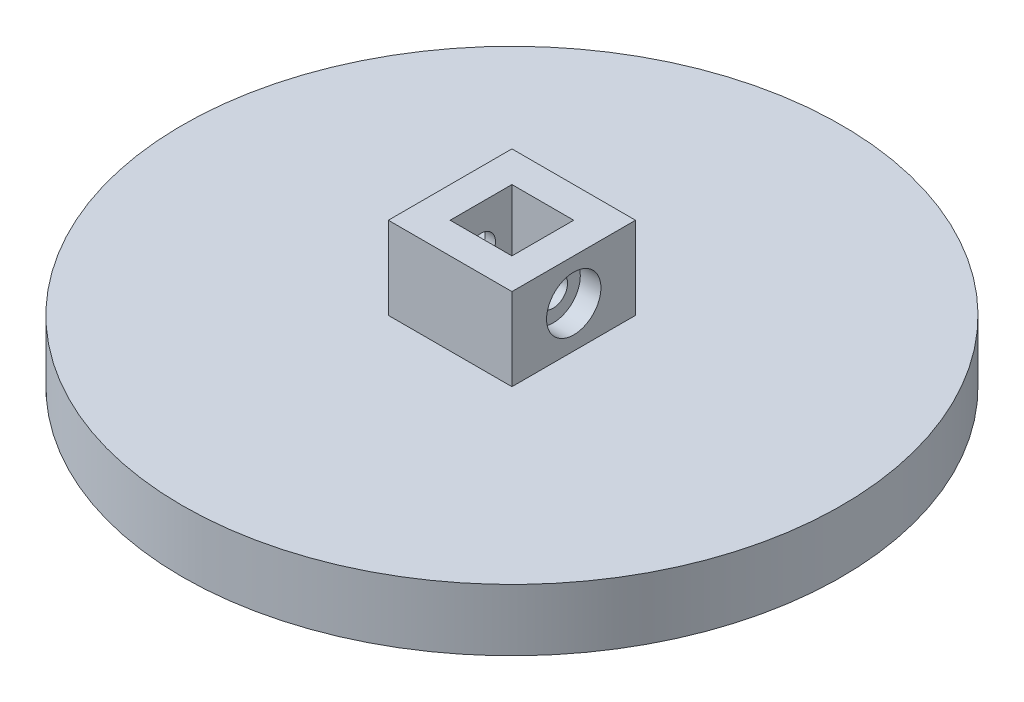
ISO-10303-21;
HEADER;
FILE_DESCRIPTION(('STEP AP214'),'2;1');
FILE_NAME('part.step','',(''),(''),'','','');
FILE_SCHEMA(('AUTOMOTIVE_DESIGN { 1 0 10303 214 1 1 1 1 }'));
ENDSEC;
DATA;
#1=APPLICATION_CONTEXT('core data for automotive mechanical design processes');
#2=APPLICATION_PROTOCOL_DEFINITION('international standard','automotive_design',2000,#1);
#3=PRODUCT_CONTEXT('',#1,'mechanical');
#4=PRODUCT('Part','Part','',(#3));
#5=PRODUCT_RELATED_PRODUCT_CATEGORY('part','',(#4));
#6=PRODUCT_DEFINITION_FORMATION('','',#4);
#7=PRODUCT_DEFINITION_CONTEXT('part definition',#1,'design');
#8=PRODUCT_DEFINITION('design','',#6,#7);
#9=PRODUCT_DEFINITION_SHAPE('','',#8);
#10=(LENGTH_UNIT() NAMED_UNIT(*) SI_UNIT(.MILLI.,.METRE.));
#11=(NAMED_UNIT(*) PLANE_ANGLE_UNIT() SI_UNIT($,.RADIAN.));
#12=(NAMED_UNIT(*) SI_UNIT($,.STERADIAN.) SOLID_ANGLE_UNIT());
#13=UNCERTAINTY_MEASURE_WITH_UNIT(LENGTH_MEASURE(1.E-05),#10,'distance_accuracy_value','');
#14=(GEOMETRIC_REPRESENTATION_CONTEXT(3) GLOBAL_UNCERTAINTY_ASSIGNED_CONTEXT((#13)) GLOBAL_UNIT_ASSIGNED_CONTEXT((#10,
#11,#12)) REPRESENTATION_CONTEXT('',''));
#15=CARTESIAN_POINT('',(0.,0.,0.));
#16=DIRECTION('',(0.,0.,1.));
#17=DIRECTION('',(1.,0.,0.));
#18=AXIS2_PLACEMENT_3D('',#15,#16,#17);
#19=CARTESIAN_POINT('',(-12.4497474683058,12.5,0.));
#20=DIRECTION('',(1.,0.,0.));
#21=DIRECTION('',(0.,0.,-1.));
#22=AXIS2_PLACEMENT_3D('',#19,#20,#21);
#23=CYLINDRICAL_SURFACE('',#22,1.75);
#24=CARTESIAN_POINT('',(3.75,12.5,0.));
#25=DIRECTION('',(1.,0.,0.));
#26=DIRECTION('',(0.,0.,-1.));
#27=AXIS2_PLACEMENT_3D('',#24,#25,#26);
#28=CIRCLE('',#27,1.75);
#29=CARTESIAN_POINT('',(3.75,12.5,-1.75));
#30=VERTEX_POINT('',#29);
#31=EDGE_CURVE('E187',#30,#30,#28,.F.);
#32=ORIENTED_EDGE('',*,*,#31,.T.);
#33=EDGE_LOOP('',(#32));
#34=FACE_BOUND('',#33,.T.);
#35=CARTESIAN_POINT('',(5.,12.5,0.));
#36=DIRECTION('',(1.,0.,0.));
#37=DIRECTION('',(0.,0.,-1.));
#38=AXIS2_PLACEMENT_3D('',#35,#36,#37);
#39=CIRCLE('',#38,1.75);
#40=CARTESIAN_POINT('',(5.,12.5,-1.75));
#41=VERTEX_POINT('',#40);
#42=EDGE_CURVE('E261',#41,#41,#39,.F.);
#43=ORIENTED_EDGE('',*,*,#42,.F.);
#44=EDGE_LOOP('',(#43));
#45=FACE_BOUND('',#44,.T.);
#46=ADVANCED_FACE('F39',(#34,#45),#23,.F.);
#47=CARTESIAN_POINT('',(-3.75,12.5,0.));
#48=DIRECTION('',(-1.,0.,0.));
#49=DIRECTION('',(0.,0.,1.));
#50=AXIS2_PLACEMENT_3D('',#47,#48,#49);
#51=CIRCLE('',#50,1.75);
#52=CARTESIAN_POINT('',(-3.75,12.5,1.75));
#53=VERTEX_POINT('',#52);
#54=EDGE_CURVE('E182',#53,#53,#51,.F.);
#55=ORIENTED_EDGE('',*,*,#54,.T.);
#56=EDGE_LOOP('',(#55));
#57=FACE_BOUND('',#56,.T.);
#58=CARTESIAN_POINT('',(-5.,12.5,0.));
#59=DIRECTION('',(-1.,0.,0.));
#60=DIRECTION('',(0.,0.,1.));
#61=AXIS2_PLACEMENT_3D('',#58,#59,#60);
#62=CIRCLE('',#61,1.75);
#63=CARTESIAN_POINT('',(-5.,12.5,1.75));
#64=VERTEX_POINT('',#63);
#65=EDGE_CURVE('E43',#64,#64,#62,.F.);
#66=ORIENTED_EDGE('',*,*,#65,.F.);
#67=EDGE_LOOP('',(#66));
#68=FACE_BOUND('',#67,.T.);
#69=ADVANCED_FACE('F320',(#57,#68),#23,.F.);
#70=CARTESIAN_POINT('',(0.,7.5,0.));
#71=DIRECTION('',(0.,-1.,0.));
#72=DIRECTION('',(0.,0.,-1.));
#73=AXIS2_PLACEMENT_3D('',#70,#71,#72);
#74=CYLINDRICAL_SURFACE('',#73,40.);
#75=CARTESIAN_POINT('',(0.,7.5,0.));
#76=DIRECTION('',(0.,1.,0.));
#77=DIRECTION('',(0.,0.,1.));
#78=AXIS2_PLACEMENT_3D('',#75,#76,#77);
#79=CIRCLE('',#78,40.);
#80=CARTESIAN_POINT('',(0.,7.5,40.));
#81=VERTEX_POINT('',#80);
#82=EDGE_CURVE('E11',#81,#81,#79,.T.);
#83=ORIENTED_EDGE('',*,*,#82,.F.);
#84=EDGE_LOOP('',(#83));
#85=FACE_BOUND('',#84,.T.);
#86=CARTESIAN_POINT('',(0.,0.,0.));
#87=DIRECTION('',(0.,1.,0.));
#88=DIRECTION('',(0.,0.,1.));
#89=AXIS2_PLACEMENT_3D('',#86,#87,#88);
#90=CIRCLE('',#89,40.);
#91=CARTESIAN_POINT('',(0.,0.,40.));
#92=VERTEX_POINT('',#91);
#93=EDGE_CURVE('E49',#92,#92,#90,.T.);
#94=ORIENTED_EDGE('',*,*,#93,.T.);
#95=EDGE_LOOP('',(#94));
#96=FACE_BOUND('',#95,.T.);
#97=ADVANCED_FACE('F41',(#85,#96),#74,.T.);
#98=CARTESIAN_POINT('',(0.,7.5,0.));
#99=DIRECTION('',(0.,1.,0.));
#100=DIRECTION('',(0.,0.,1.));
#101=AXIS2_PLACEMENT_3D('',#98,#99,#100);
#102=PLANE('',#101);
#103=DIRECTION('',(0.,0.,-1.));
#104=VECTOR('',#103,1.);
#105=CARTESIAN_POINT('',(7.5,7.5,7.5));
#106=LINE('',#105,#104);
#107=CARTESIAN_POINT('',(7.5,7.5,7.5));
#108=VERTEX_POINT('',#107);
#109=CARTESIAN_POINT('',(7.5,7.5,-7.5));
#110=VERTEX_POINT('',#109);
#111=EDGE_CURVE('E281',#108,#110,#106,.T.);
#112=ORIENTED_EDGE('',*,*,#111,.F.);
#113=DIRECTION('',(1.,0.,0.));
#114=VECTOR('',#113,1.);
#115=CARTESIAN_POINT('',(-7.5,7.5,7.5));
#116=LINE('',#115,#114);
#117=CARTESIAN_POINT('',(-7.5,7.5,7.5));
#118=VERTEX_POINT('',#117);
#119=EDGE_CURVE('E271',#118,#108,#116,.T.);
#120=ORIENTED_EDGE('',*,*,#119,.F.);
#121=DIRECTION('',(0.,0.,1.));
#122=VECTOR('',#121,1.);
#123=CARTESIAN_POINT('',(-7.5,7.5,7.5));
#124=LINE('',#123,#122);
#125=CARTESIAN_POINT('',(-7.5,7.5,-7.5));
#126=VERTEX_POINT('',#125);
#127=EDGE_CURVE('E289',#126,#118,#124,.T.);
#128=ORIENTED_EDGE('',*,*,#127,.F.);
#129=DIRECTION('',(-1.,0.,0.));
#130=VECTOR('',#129,1.);
#131=CARTESIAN_POINT('',(-7.5,7.5,-7.5));
#132=LINE('',#131,#130);
#133=EDGE_CURVE('E285',#110,#126,#132,.T.);
#134=ORIENTED_EDGE('',*,*,#133,.F.);
#135=EDGE_LOOP('',(#112,#120,#128,#134));
#136=FACE_BOUND('',#135,.T.);
#137=ORIENTED_EDGE('',*,*,#82,.T.);
#138=EDGE_LOOP('',(#137));
#139=FACE_BOUND('',#138,.T.);
#140=ADVANCED_FACE('F350',(#136,#139),#102,.T.);
#141=CARTESIAN_POINT('',(0.,0.,0.));
#142=DIRECTION('',(0.,1.,0.));
#143=DIRECTION('',(0.,0.,1.));
#144=AXIS2_PLACEMENT_3D('',#141,#142,#143);
#145=PLANE('',#144);
#146=DIRECTION('',(-1.,0.,0.));
#147=VECTOR('',#146,1.);
#148=CARTESIAN_POINT('',(-3.75,0.,3.75));
#149=LINE('',#148,#147);
#150=CARTESIAN_POINT('',(3.75,0.,3.75));
#151=VERTEX_POINT('',#150);
#152=CARTESIAN_POINT('',(-3.75,0.,3.75));
#153=VERTEX_POINT('',#152);
#154=EDGE_CURVE('E360',#151,#153,#149,.T.);
#155=ORIENTED_EDGE('',*,*,#154,.F.);
#156=DIRECTION('',(0.,0.,1.));
#157=VECTOR('',#156,1.);
#158=CARTESIAN_POINT('',(3.75,0.,3.75));
#159=LINE('',#158,#157);
#160=CARTESIAN_POINT('',(3.75,0.,-3.75));
#161=VERTEX_POINT('',#160);
#162=EDGE_CURVE('E183',#161,#151,#159,.T.);
#163=ORIENTED_EDGE('',*,*,#162,.F.);
#164=DIRECTION('',(1.,0.,0.));
#165=VECTOR('',#164,1.);
#166=CARTESIAN_POINT('',(-3.75,0.,-3.75));
#167=LINE('',#166,#165);
#168=CARTESIAN_POINT('',(-3.75,0.,-3.75));
#169=VERTEX_POINT('',#168);
#170=EDGE_CURVE('E179',#169,#161,#167,.T.);
#171=ORIENTED_EDGE('',*,*,#170,.F.);
#172=DIRECTION('',(0.,0.,-1.));
#173=VECTOR('',#172,1.);
#174=CARTESIAN_POINT('',(-3.75,0.,3.75));
#175=LINE('',#174,#173);
#176=EDGE_CURVE('E150',#153,#169,#175,.T.);
#177=ORIENTED_EDGE('',*,*,#176,.F.);
#178=EDGE_LOOP('',(#155,#163,#171,#177));
#179=FACE_BOUND('',#178,.T.);
#180=ORIENTED_EDGE('',*,*,#93,.F.);
#181=EDGE_LOOP('',(#180));
#182=FACE_BOUND('',#181,.T.);
#183=ADVANCED_FACE('F348',(#179,#182),#145,.F.);
#184=CARTESIAN_POINT('',(7.5,17.5,7.5));
#185=DIRECTION('',(-1.,0.,0.));
#186=DIRECTION('',(0.,0.,1.));
#187=AXIS2_PLACEMENT_3D('',#184,#185,#186);
#188=PLANE('',#187);
#189=CARTESIAN_POINT('',(7.5,12.5,0.));
#190=DIRECTION('',(1.,0.,0.));
#191=DIRECTION('',(0.,0.,-1.));
#192=AXIS2_PLACEMENT_3D('',#189,#190,#191);
#193=CIRCLE('',#192,3.3);
#194=CARTESIAN_POINT('',(7.5,12.5,-3.3));
#195=VERTEX_POINT('',#194);
#196=EDGE_CURVE('E262',#195,#195,#193,.T.);
#197=ORIENTED_EDGE('',*,*,#196,.F.);
#198=EDGE_LOOP('',(#197));
#199=FACE_BOUND('',#198,.T.);
#200=ORIENTED_EDGE('',*,*,#111,.T.);
#201=DIRECTION('',(0.,-1.,0.));
#202=VECTOR('',#201,1.);
#203=CARTESIAN_POINT('',(7.5,17.5,-7.5));
#204=LINE('',#203,#202);
#205=CARTESIAN_POINT('',(7.5,17.5,-7.5));
#206=VERTEX_POINT('',#205);
#207=EDGE_CURVE('E307',#206,#110,#204,.T.);
#208=ORIENTED_EDGE('',*,*,#207,.F.);
#209=DIRECTION('',(0.,0.,-1.));
#210=VECTOR('',#209,1.);
#211=CARTESIAN_POINT('',(7.5,17.5,7.5));
#212=LINE('',#211,#210);
#213=CARTESIAN_POINT('',(7.5,17.5,7.5));
#214=VERTEX_POINT('',#213);
#215=EDGE_CURVE('E266',#214,#206,#212,.T.);
#216=ORIENTED_EDGE('',*,*,#215,.F.);
#217=DIRECTION('',(0.,-1.,0.));
#218=VECTOR('',#217,1.);
#219=CARTESIAN_POINT('',(7.5,17.5,7.5));
#220=LINE('',#219,#218);
#221=EDGE_CURVE('E280',#214,#108,#220,.T.);
#222=ORIENTED_EDGE('',*,*,#221,.T.);
#223=EDGE_LOOP('',(#200,#208,#216,#222));
#224=FACE_BOUND('',#223,.T.);
#225=ADVANCED_FACE('F344',(#199,#224),#188,.F.);
#226=CARTESIAN_POINT('',(-7.5,17.5,-7.5));
#227=DIRECTION('',(0.,0.,1.));
#228=DIRECTION('',(1.,0.,0.));
#229=AXIS2_PLACEMENT_3D('',#226,#227,#228);
#230=PLANE('',#229);
#231=ORIENTED_EDGE('',*,*,#133,.T.);
#232=DIRECTION('',(0.,-1.,0.));
#233=VECTOR('',#232,1.);
#234=CARTESIAN_POINT('',(-7.5,17.5,-7.5));
#235=LINE('',#234,#233);
#236=CARTESIAN_POINT('',(-7.5,17.5,-7.5));
#237=VERTEX_POINT('',#236);
#238=EDGE_CURVE('E303',#237,#126,#235,.T.);
#239=ORIENTED_EDGE('',*,*,#238,.F.);
#240=DIRECTION('',(-1.,0.,0.));
#241=VECTOR('',#240,1.);
#242=CARTESIAN_POINT('',(-7.5,17.5,-7.5));
#243=LINE('',#242,#241);
#244=EDGE_CURVE('E270',#206,#237,#243,.T.);
#245=ORIENTED_EDGE('',*,*,#244,.F.);
#246=ORIENTED_EDGE('',*,*,#207,.T.);
#247=EDGE_LOOP('',(#231,#239,#245,#246));
#248=FACE_BOUND('',#247,.T.);
#249=ADVANCED_FACE('F340',(#248),#230,.F.);
#250=CARTESIAN_POINT('',(-7.5,17.5,7.5));
#251=DIRECTION('',(1.,0.,0.));
#252=DIRECTION('',(0.,0.,-1.));
#253=AXIS2_PLACEMENT_3D('',#250,#251,#252);
#254=PLANE('',#253);
#255=DIRECTION('',(0.,-0.866025403784439,0.5));
#256=VECTOR('',#255,1.);
#257=CARTESIAN_POINT('',(-7.5,12.5,-3.35));
#258=LINE('',#257,#256);
#259=CARTESIAN_POINT('',(-7.5,12.5,-3.35));
#260=VERTEX_POINT('',#259);
#261=CARTESIAN_POINT('',(-7.5,9.59881489732213,-1.675));
#262=VERTEX_POINT('',#261);
#263=EDGE_CURVE('E220',#260,#262,#258,.T.);
#264=ORIENTED_EDGE('',*,*,#263,.F.);
#265=DIRECTION('',(0.,-0.866025403784439,-0.5));
#266=VECTOR('',#265,1.);
#267=CARTESIAN_POINT('',(-7.5,15.4011851026779,-1.675));
#268=LINE('',#267,#266);
#269=CARTESIAN_POINT('',(-7.5,15.4011851026779,-1.675));
#270=VERTEX_POINT('',#269);
#271=EDGE_CURVE('E191',#270,#260,#268,.T.);
#272=ORIENTED_EDGE('',*,*,#271,.F.);
#273=DIRECTION('',(0.,0.,-1.));
#274=VECTOR('',#273,1.);
#275=CARTESIAN_POINT('',(-7.5,15.4011851026779,1.675));
#276=LINE('',#275,#274);
#277=CARTESIAN_POINT('',(-7.5,15.4011851026779,1.675));
#278=VERTEX_POINT('',#277);
#279=EDGE_CURVE('E197',#278,#270,#276,.T.);
#280=ORIENTED_EDGE('',*,*,#279,.F.);
#281=DIRECTION('',(0.,0.866025403784439,-0.5));
#282=VECTOR('',#281,1.);
#283=CARTESIAN_POINT('',(-7.5,12.5,3.35));
#284=LINE('',#283,#282);
#285=CARTESIAN_POINT('',(-7.5,12.5,3.35));
#286=VERTEX_POINT('',#285);
#287=EDGE_CURVE('E232',#286,#278,#284,.T.);
#288=ORIENTED_EDGE('',*,*,#287,.F.);
#289=DIRECTION('',(0.,0.866025403784439,0.5));
#290=VECTOR('',#289,1.);
#291=CARTESIAN_POINT('',(-7.5,9.59881489732213,1.675));
#292=LINE('',#291,#290);
#293=CARTESIAN_POINT('',(-7.5,9.59881489732213,1.675));
#294=VERTEX_POINT('',#293);
#295=EDGE_CURVE('E228',#294,#286,#292,.T.);
#296=ORIENTED_EDGE('',*,*,#295,.F.);
#297=DIRECTION('',(0.,0.,1.));
#298=VECTOR('',#297,1.);
#299=CARTESIAN_POINT('',(-7.5,9.59881489732213,-1.675));
#300=LINE('',#299,#298);
#301=EDGE_CURVE('E224',#262,#294,#300,.T.);
#302=ORIENTED_EDGE('',*,*,#301,.F.);
#303=EDGE_LOOP('',(#264,#272,#280,#288,#296,#302));
#304=FACE_BOUND('',#303,.T.);
#305=ORIENTED_EDGE('',*,*,#127,.T.);
#306=DIRECTION('',(0.,-1.,0.));
#307=VECTOR('',#306,1.);
#308=CARTESIAN_POINT('',(-7.5,17.5,7.5));
#309=LINE('',#308,#307);
#310=CARTESIAN_POINT('',(-7.5,17.5,7.5));
#311=VERTEX_POINT('',#310);
#312=EDGE_CURVE('E299',#311,#118,#309,.T.);
#313=ORIENTED_EDGE('',*,*,#312,.F.);
#314=DIRECTION('',(0.,0.,1.));
#315=VECTOR('',#314,1.);
#316=CARTESIAN_POINT('',(-7.5,17.5,7.5));
#317=LINE('',#316,#315);
#318=EDGE_CURVE('E274',#237,#311,#317,.T.);
#319=ORIENTED_EDGE('',*,*,#318,.F.);
#320=ORIENTED_EDGE('',*,*,#238,.T.);
#321=EDGE_LOOP('',(#305,#313,#319,#320));
#322=FACE_BOUND('',#321,.T.);
#323=ADVANCED_FACE('F336',(#304,#322),#254,.F.);
#324=CARTESIAN_POINT('',(-7.5,17.5,7.5));
#325=DIRECTION('',(0.,0.,-1.));
#326=DIRECTION('',(-1.,0.,0.));
#327=AXIS2_PLACEMENT_3D('',#324,#325,#326);
#328=PLANE('',#327);
#329=ORIENTED_EDGE('',*,*,#119,.T.);
#330=ORIENTED_EDGE('',*,*,#221,.F.);
#331=DIRECTION('',(1.,0.,0.));
#332=VECTOR('',#331,1.);
#333=CARTESIAN_POINT('',(-7.5,17.5,7.5));
#334=LINE('',#333,#332);
#335=EDGE_CURVE('E277',#311,#214,#334,.T.);
#336=ORIENTED_EDGE('',*,*,#335,.F.);
#337=ORIENTED_EDGE('',*,*,#312,.T.);
#338=EDGE_LOOP('',(#329,#330,#336,#337));
#339=FACE_BOUND('',#338,.T.);
#340=ADVANCED_FACE('F333',(#339),#328,.F.);
#341=CARTESIAN_POINT('',(0.,17.5,0.));
#342=DIRECTION('',(0.,-1.,0.));
#343=DIRECTION('',(0.,0.,-1.));
#344=AXIS2_PLACEMENT_3D('',#341,#342,#343);
#345=PLANE('',#344);
#346=DIRECTION('',(-1.,0.,0.));
#347=VECTOR('',#346,1.);
#348=CARTESIAN_POINT('',(-3.75,17.5,-3.75));
#349=LINE('',#348,#347);
#350=CARTESIAN_POINT('',(3.75,17.5,-3.75));
#351=VERTEX_POINT('',#350);
#352=CARTESIAN_POINT('',(-3.75,17.5,-3.75));
#353=VERTEX_POINT('',#352);
#354=EDGE_CURVE('E157',#351,#353,#349,.T.);
#355=ORIENTED_EDGE('',*,*,#354,.F.);
#356=DIRECTION('',(0.,0.,-1.));
#357=VECTOR('',#356,1.);
#358=CARTESIAN_POINT('',(3.75,17.5,3.75));
#359=LINE('',#358,#357);
#360=CARTESIAN_POINT('',(3.75,17.5,3.75));
#361=VERTEX_POINT('',#360);
#362=EDGE_CURVE('E65',#361,#351,#359,.T.);
#363=ORIENTED_EDGE('',*,*,#362,.F.);
#364=DIRECTION('',(1.,0.,0.));
#365=VECTOR('',#364,1.);
#366=CARTESIAN_POINT('',(-3.75,17.5,3.75));
#367=LINE('',#366,#365);
#368=CARTESIAN_POINT('',(-3.75,17.5,3.75));
#369=VERTEX_POINT('',#368);
#370=EDGE_CURVE('E165',#369,#361,#367,.T.);
#371=ORIENTED_EDGE('',*,*,#370,.F.);
#372=DIRECTION('',(0.,0.,1.));
#373=VECTOR('',#372,1.);
#374=CARTESIAN_POINT('',(-3.75,17.5,3.75));
#375=LINE('',#374,#373);
#376=EDGE_CURVE('E147',#353,#369,#375,.T.);
#377=ORIENTED_EDGE('',*,*,#376,.F.);
#378=EDGE_LOOP('',(#355,#363,#371,#377));
#379=FACE_BOUND('',#378,.T.);
#380=ORIENTED_EDGE('',*,*,#215,.T.);
#381=ORIENTED_EDGE('',*,*,#244,.T.);
#382=ORIENTED_EDGE('',*,*,#318,.T.);
#383=ORIENTED_EDGE('',*,*,#335,.T.);
#384=EDGE_LOOP('',(#380,#381,#382,#383));
#385=FACE_BOUND('',#384,.T.);
#386=ADVANCED_FACE('F162',(#379,#385),#345,.F.);
#387=CARTESIAN_POINT('',(5.,12.5,0.));
#388=DIRECTION('',(1.,0.,0.));
#389=DIRECTION('',(0.,0.,-1.));
#390=AXIS2_PLACEMENT_3D('',#387,#388,#389);
#391=PLANE('',#390);
#392=CARTESIAN_POINT('',(5.,12.5,0.));
#393=DIRECTION('',(1.,0.,0.));
#394=DIRECTION('',(0.,0.,-1.));
#395=AXIS2_PLACEMENT_3D('',#392,#393,#394);
#396=CIRCLE('',#395,3.3);
#397=CARTESIAN_POINT('',(5.,12.5,-3.3));
#398=VERTEX_POINT('',#397);
#399=EDGE_CURVE('E257',#398,#398,#396,.T.);
#400=ORIENTED_EDGE('',*,*,#399,.T.);
#401=EDGE_LOOP('',(#400));
#402=FACE_BOUND('',#401,.T.);
#403=ORIENTED_EDGE('',*,*,#42,.T.);
#404=EDGE_LOOP('',(#403));
#405=FACE_BOUND('',#404,.T.);
#406=ADVANCED_FACE('F317',(#402,#405),#391,.T.);
#407=CARTESIAN_POINT('',(5.,12.5,0.));
#408=DIRECTION('',(1.,0.,0.));
#409=DIRECTION('',(0.,0.,-1.));
#410=AXIS2_PLACEMENT_3D('',#407,#408,#409);
#411=CYLINDRICAL_SURFACE('',#410,3.3);
#412=ORIENTED_EDGE('',*,*,#399,.F.);
#413=EDGE_LOOP('',(#412));
#414=FACE_BOUND('',#413,.T.);
#415=ORIENTED_EDGE('',*,*,#196,.T.);
#416=EDGE_LOOP('',(#415));
#417=FACE_BOUND('',#416,.T.);
#418=ADVANCED_FACE('F329',(#414,#417),#411,.F.);
#419=CARTESIAN_POINT('',(-5.,0.,0.));
#420=DIRECTION('',(-1.,0.,0.));
#421=DIRECTION('',(0.,0.,1.));
#422=AXIS2_PLACEMENT_3D('',#419,#420,#421);
#423=PLANE('',#422);
#424=DIRECTION('',(0.,-0.866025403784439,-0.5));
#425=VECTOR('',#424,1.);
#426=CARTESIAN_POINT('',(-5.,15.4011851026779,-1.675));
#427=LINE('',#426,#425);
#428=CARTESIAN_POINT('',(-5.,15.4011851026779,-1.675));
#429=VERTEX_POINT('',#428);
#430=CARTESIAN_POINT('',(-5.,12.5,-3.35));
#431=VERTEX_POINT('',#430);
#432=EDGE_CURVE('E192',#429,#431,#427,.T.);
#433=ORIENTED_EDGE('',*,*,#432,.T.);
#434=DIRECTION('',(0.,-0.866025403784439,0.5));
#435=VECTOR('',#434,1.);
#436=CARTESIAN_POINT('',(-5.,12.5,-3.35));
#437=LINE('',#436,#435);
#438=CARTESIAN_POINT('',(-5.,9.59881489732213,-1.675));
#439=VERTEX_POINT('',#438);
#440=EDGE_CURVE('E196',#431,#439,#437,.T.);
#441=ORIENTED_EDGE('',*,*,#440,.T.);
#442=DIRECTION('',(0.,0.,1.));
#443=VECTOR('',#442,1.);
#444=CARTESIAN_POINT('',(-5.,9.59881489732213,-1.675));
#445=LINE('',#444,#443);
#446=CARTESIAN_POINT('',(-5.,9.59881489732213,1.675));
#447=VERTEX_POINT('',#446);
#448=EDGE_CURVE('E201',#439,#447,#445,.T.);
#449=ORIENTED_EDGE('',*,*,#448,.T.);
#450=DIRECTION('',(0.,0.866025403784439,0.5));
#451=VECTOR('',#450,1.);
#452=CARTESIAN_POINT('',(-5.,9.59881489732213,1.675));
#453=LINE('',#452,#451);
#454=CARTESIAN_POINT('',(-5.,12.5,3.35));
#455=VERTEX_POINT('',#454);
#456=EDGE_CURVE('E205',#447,#455,#453,.T.);
#457=ORIENTED_EDGE('',*,*,#456,.T.);
#458=DIRECTION('',(0.,0.866025403784439,-0.5));
#459=VECTOR('',#458,1.);
#460=CARTESIAN_POINT('',(-5.,12.5,3.35));
#461=LINE('',#460,#459);
#462=CARTESIAN_POINT('',(-5.,15.4011851026779,1.675));
#463=VERTEX_POINT('',#462);
#464=EDGE_CURVE('E209',#455,#463,#461,.T.);
#465=ORIENTED_EDGE('',*,*,#464,.T.);
#466=DIRECTION('',(0.,0.,-1.));
#467=VECTOR('',#466,1.);
#468=CARTESIAN_POINT('',(-5.,15.4011851026779,1.675));
#469=LINE('',#468,#467);
#470=EDGE_CURVE('E213',#463,#429,#469,.T.);
#471=ORIENTED_EDGE('',*,*,#470,.T.);
#472=EDGE_LOOP('',(#433,#441,#449,#457,#465,#471));
#473=FACE_BOUND('',#472,.T.);
#474=ORIENTED_EDGE('',*,*,#65,.T.);
#475=EDGE_LOOP('',(#474));
#476=FACE_BOUND('',#475,.T.);
#477=ADVANCED_FACE('F413',(#473,#476),#423,.T.);
#478=CARTESIAN_POINT('',(-5.,15.4011851026779,-1.675));
#479=DIRECTION('',(0.,0.5,-0.866025403784439));
#480=DIRECTION('',(0.,0.866025403784439,0.5));
#481=AXIS2_PLACEMENT_3D('',#478,#479,#480);
#482=PLANE('',#481);
#483=ORIENTED_EDGE('',*,*,#271,.T.);
#484=DIRECTION('',(-1.,0.,0.));
#485=VECTOR('',#484,1.);
#486=CARTESIAN_POINT('',(-5.,12.5,-3.35));
#487=LINE('',#486,#485);
#488=EDGE_CURVE('E217',#431,#260,#487,.T.);
#489=ORIENTED_EDGE('',*,*,#488,.F.);
#490=ORIENTED_EDGE('',*,*,#432,.F.);
#491=DIRECTION('',(-1.,0.,0.));
#492=VECTOR('',#491,1.);
#493=CARTESIAN_POINT('',(-5.,15.4011851026779,-1.675));
#494=LINE('',#493,#492);
#495=EDGE_CURVE('E239',#429,#270,#494,.T.);
#496=ORIENTED_EDGE('',*,*,#495,.T.);
#497=EDGE_LOOP('',(#483,#489,#490,#496));
#498=FACE_BOUND('',#497,.T.);
#499=ADVANCED_FACE('F428',(#498),#482,.F.);
#500=CARTESIAN_POINT('',(-5.,15.4011851026779,1.675));
#501=DIRECTION('',(0.,1.,0.));
#502=DIRECTION('',(0.,0.,1.));
#503=AXIS2_PLACEMENT_3D('',#500,#501,#502);
#504=PLANE('',#503);
#505=ORIENTED_EDGE('',*,*,#279,.T.);
#506=ORIENTED_EDGE('',*,*,#495,.F.);
#507=ORIENTED_EDGE('',*,*,#470,.F.);
#508=DIRECTION('',(-1.,0.,0.));
#509=VECTOR('',#508,1.);
#510=CARTESIAN_POINT('',(-5.,15.4011851026779,1.675));
#511=LINE('',#510,#509);
#512=EDGE_CURVE('E242',#463,#278,#511,.T.);
#513=ORIENTED_EDGE('',*,*,#512,.T.);
#514=EDGE_LOOP('',(#505,#506,#507,#513));
#515=FACE_BOUND('',#514,.T.);
#516=ADVANCED_FACE('F438',(#515),#504,.F.);
#517=CARTESIAN_POINT('',(-5.,12.5,3.35));
#518=DIRECTION('',(0.,0.5,0.866025403784439));
#519=DIRECTION('',(0.,-0.866025403784439,0.5));
#520=AXIS2_PLACEMENT_3D('',#517,#518,#519);
#521=PLANE('',#520);
#522=ORIENTED_EDGE('',*,*,#287,.T.);
#523=ORIENTED_EDGE('',*,*,#512,.F.);
#524=ORIENTED_EDGE('',*,*,#464,.F.);
#525=DIRECTION('',(-1.,0.,0.));
#526=VECTOR('',#525,1.);
#527=CARTESIAN_POINT('',(-5.,12.5,3.35));
#528=LINE('',#527,#526);
#529=EDGE_CURVE('E245',#455,#286,#528,.T.);
#530=ORIENTED_EDGE('',*,*,#529,.T.);
#531=EDGE_LOOP('',(#522,#523,#524,#530));
#532=FACE_BOUND('',#531,.T.);
#533=ADVANCED_FACE('F448',(#532),#521,.F.);
#534=CARTESIAN_POINT('',(-5.,9.59881489732213,1.675));
#535=DIRECTION('',(0.,-0.5,0.866025403784439));
#536=DIRECTION('',(0.,-0.866025403784439,-0.5));
#537=AXIS2_PLACEMENT_3D('',#534,#535,#536);
#538=PLANE('',#537);
#539=ORIENTED_EDGE('',*,*,#295,.T.);
#540=ORIENTED_EDGE('',*,*,#529,.F.);
#541=ORIENTED_EDGE('',*,*,#456,.F.);
#542=DIRECTION('',(-1.,0.,0.));
#543=VECTOR('',#542,1.);
#544=CARTESIAN_POINT('',(-5.,9.59881489732213,1.675));
#545=LINE('',#544,#543);
#546=EDGE_CURVE('E248',#447,#294,#545,.T.);
#547=ORIENTED_EDGE('',*,*,#546,.T.);
#548=EDGE_LOOP('',(#539,#540,#541,#547));
#549=FACE_BOUND('',#548,.T.);
#550=ADVANCED_FACE('F458',(#549),#538,.F.);
#551=CARTESIAN_POINT('',(-5.,9.59881489732213,-1.675));
#552=DIRECTION('',(0.,-1.,0.));
#553=DIRECTION('',(0.,0.,-1.));
#554=AXIS2_PLACEMENT_3D('',#551,#552,#553);
#555=PLANE('',#554);
#556=ORIENTED_EDGE('',*,*,#301,.T.);
#557=ORIENTED_EDGE('',*,*,#546,.F.);
#558=ORIENTED_EDGE('',*,*,#448,.F.);
#559=DIRECTION('',(-1.,0.,0.));
#560=VECTOR('',#559,1.);
#561=CARTESIAN_POINT('',(-5.,9.59881489732213,-1.675));
#562=LINE('',#561,#560);
#563=EDGE_CURVE('E251',#439,#262,#562,.T.);
#564=ORIENTED_EDGE('',*,*,#563,.T.);
#565=EDGE_LOOP('',(#556,#557,#558,#564));
#566=FACE_BOUND('',#565,.T.);
#567=ADVANCED_FACE('F468',(#566),#555,.F.);
#568=CARTESIAN_POINT('',(-5.,12.5,-3.35));
#569=DIRECTION('',(0.,-0.5,-0.866025403784439));
#570=DIRECTION('',(0.,0.866025403784439,-0.5));
#571=AXIS2_PLACEMENT_3D('',#568,#569,#570);
#572=PLANE('',#571);
#573=ORIENTED_EDGE('',*,*,#263,.T.);
#574=ORIENTED_EDGE('',*,*,#563,.F.);
#575=ORIENTED_EDGE('',*,*,#440,.F.);
#576=ORIENTED_EDGE('',*,*,#488,.T.);
#577=EDGE_LOOP('',(#573,#574,#575,#576));
#578=FACE_BOUND('',#577,.T.);
#579=ADVANCED_FACE('F478',(#578),#572,.F.);
#580=CARTESIAN_POINT('',(3.75,-10.6066017177982,3.75));
#581=DIRECTION('',(1.,0.,0.));
#582=DIRECTION('',(0.,0.,-1.));
#583=AXIS2_PLACEMENT_3D('',#580,#581,#582);
#584=PLANE('',#583);
#585=ORIENTED_EDGE('',*,*,#162,.T.);
#586=DIRECTION('',(0.,1.,0.));
#587=VECTOR('',#586,1.);
#588=CARTESIAN_POINT('',(3.75,-10.6066017177982,3.75));
#589=LINE('',#588,#587);
#590=EDGE_CURVE('E172',#151,#361,#589,.T.);
#591=ORIENTED_EDGE('',*,*,#590,.T.);
#592=ORIENTED_EDGE('',*,*,#362,.T.);
#593=DIRECTION('',(0.,1.,0.));
#594=VECTOR('',#593,1.);
#595=CARTESIAN_POINT('',(3.75,-10.6066017177982,-3.75));
#596=LINE('',#595,#594);
#597=EDGE_CURVE('E154',#161,#351,#596,.T.);
#598=ORIENTED_EDGE('',*,*,#597,.F.);
#599=EDGE_LOOP('',(#585,#591,#592,#598));
#600=FACE_BOUND('',#599,.T.);
#601=ORIENTED_EDGE('',*,*,#31,.F.);
#602=EDGE_LOOP('',(#601));
#603=FACE_BOUND('',#602,.T.);
#604=ADVANCED_FACE('F487',(#600,#603),#584,.F.);
#605=CARTESIAN_POINT('',(-3.75,-10.6066017177982,3.75));
#606=DIRECTION('',(-1.,0.,0.));
#607=DIRECTION('',(0.,0.,1.));
#608=AXIS2_PLACEMENT_3D('',#605,#606,#607);
#609=PLANE('',#608);
#610=ORIENTED_EDGE('',*,*,#176,.T.);
#611=DIRECTION('',(0.,1.,0.));
#612=VECTOR('',#611,1.);
#613=CARTESIAN_POINT('',(-3.75,-10.6066017177982,-3.75));
#614=LINE('',#613,#612);
#615=EDGE_CURVE('E57',#169,#353,#614,.T.);
#616=ORIENTED_EDGE('',*,*,#615,.T.);
#617=ORIENTED_EDGE('',*,*,#376,.T.);
#618=DIRECTION('',(0.,1.,0.));
#619=VECTOR('',#618,1.);
#620=CARTESIAN_POINT('',(-3.75,-10.6066017177982,3.75));
#621=LINE('',#620,#619);
#622=EDGE_CURVE('E153',#153,#369,#621,.T.);
#623=ORIENTED_EDGE('',*,*,#622,.F.);
#624=EDGE_LOOP('',(#610,#616,#617,#623));
#625=FACE_BOUND('',#624,.T.);
#626=ORIENTED_EDGE('',*,*,#54,.F.);
#627=EDGE_LOOP('',(#626));
#628=FACE_BOUND('',#627,.T.);
#629=ADVANCED_FACE('F143',(#625,#628),#609,.F.);
#630=CARTESIAN_POINT('',(-3.75,-10.6066017177982,3.75));
#631=DIRECTION('',(0.,0.,1.));
#632=DIRECTION('',(1.,0.,0.));
#633=AXIS2_PLACEMENT_3D('',#630,#631,#632);
#634=PLANE('',#633);
#635=ORIENTED_EDGE('',*,*,#154,.T.);
#636=ORIENTED_EDGE('',*,*,#622,.T.);
#637=ORIENTED_EDGE('',*,*,#370,.T.);
#638=ORIENTED_EDGE('',*,*,#590,.F.);
#639=EDGE_LOOP('',(#635,#636,#637,#638));
#640=FACE_BOUND('',#639,.T.);
#641=ADVANCED_FACE('F521',(#640),#634,.F.);
#642=CARTESIAN_POINT('',(-3.75,-10.6066017177982,-3.75));
#643=DIRECTION('',(0.,0.,-1.));
#644=DIRECTION('',(-1.,0.,0.));
#645=AXIS2_PLACEMENT_3D('',#642,#643,#644);
#646=PLANE('',#645);
#647=ORIENTED_EDGE('',*,*,#170,.T.);
#648=ORIENTED_EDGE('',*,*,#597,.T.);
#649=ORIENTED_EDGE('',*,*,#354,.T.);
#650=ORIENTED_EDGE('',*,*,#615,.F.);
#651=EDGE_LOOP('',(#647,#648,#649,#650));
#652=FACE_BOUND('',#651,.T.);
#653=ADVANCED_FACE('F158',(#652),#646,.F.);
#654=CLOSED_SHELL('',(#46,#69,#97,#140,#183,#225,#249,#323,#340,#386,#406,#418,#477,#499,#516,
#533,#550,#567,#579,#604,#629,#641,#653));
#655=MANIFOLD_SOLID_BREP('B2',#654);
#656=ADVANCED_BREP_SHAPE_REPRESENTATION('',(#18,#655),#14);
#657=SHAPE_DEFINITION_REPRESENTATION(#9,#656);
ENDSEC;
END-ISO-10303-21;
